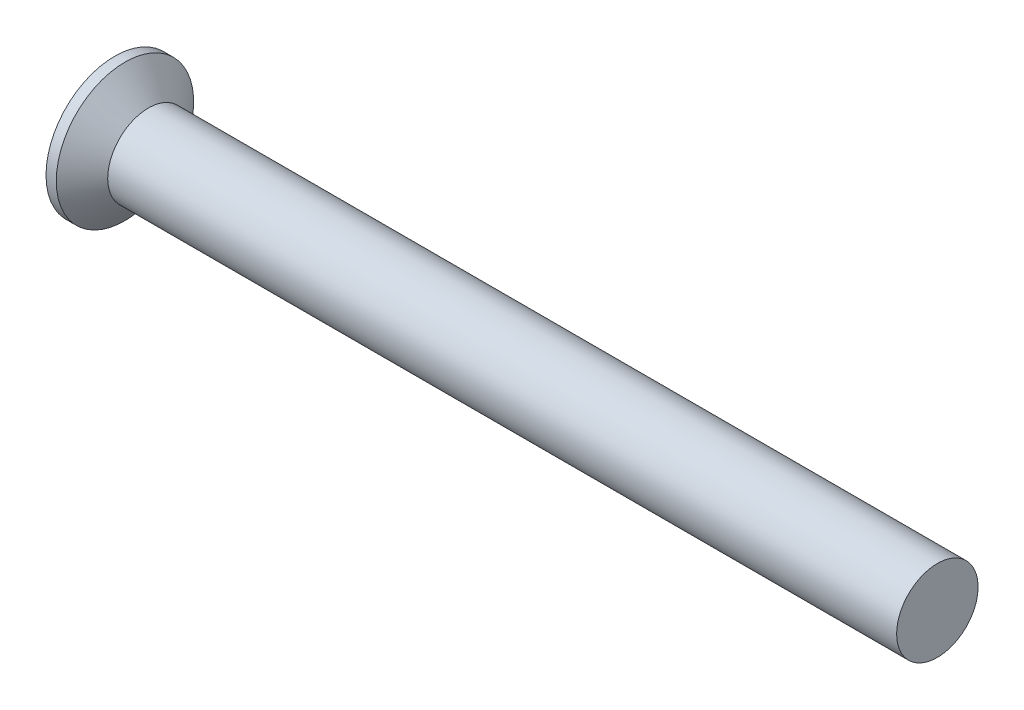
ISO-10303-21;
HEADER;
FILE_DESCRIPTION(('STEP AP214'),'2;1');
FILE_NAME('part.step','',(''),(''),'','','');
FILE_SCHEMA(('AUTOMOTIVE_DESIGN { 1 0 10303 214 1 1 1 1 }'));
ENDSEC;
DATA;
#1=APPLICATION_CONTEXT('core data for automotive mechanical design processes');
#2=APPLICATION_PROTOCOL_DEFINITION('international standard','automotive_design',2000,#1);
#3=PRODUCT_CONTEXT('',#1,'mechanical');
#4=PRODUCT('Part','Part','',(#3));
#5=PRODUCT_RELATED_PRODUCT_CATEGORY('part','',(#4));
#6=PRODUCT_DEFINITION_FORMATION('','',#4);
#7=PRODUCT_DEFINITION_CONTEXT('part definition',#1,'design');
#8=PRODUCT_DEFINITION('design','',#6,#7);
#9=PRODUCT_DEFINITION_SHAPE('','',#8);
#10=(LENGTH_UNIT() NAMED_UNIT(*) SI_UNIT(.MILLI.,.METRE.));
#11=(NAMED_UNIT(*) PLANE_ANGLE_UNIT() SI_UNIT($,.RADIAN.));
#12=(NAMED_UNIT(*) SI_UNIT($,.STERADIAN.) SOLID_ANGLE_UNIT());
#13=UNCERTAINTY_MEASURE_WITH_UNIT(LENGTH_MEASURE(1.E-05),#10,'distance_accuracy_value','');
#14=(GEOMETRIC_REPRESENTATION_CONTEXT(3) GLOBAL_UNCERTAINTY_ASSIGNED_CONTEXT((#13)) GLOBAL_UNIT_ASSIGNED_CONTEXT((#10,
#11,#12)) REPRESENTATION_CONTEXT('',''));
#15=CARTESIAN_POINT('',(0.,0.,0.));
#16=DIRECTION('',(0.,0.,1.));
#17=DIRECTION('',(1.,0.,0.));
#18=AXIS2_PLACEMENT_3D('',#15,#16,#17);
#19=CARTESIAN_POINT('',(0.,0.,0.));
#20=DIRECTION('',(-1.,0.,0.));
#21=DIRECTION('',(0.,0.,1.));
#22=AXIS2_PLACEMENT_3D('',#19,#20,#21);
#23=PLANE('',#22);
#24=CARTESIAN_POINT('',(0.,0.,0.));
#25=DIRECTION('',(-1.,0.,0.));
#26=DIRECTION('',(0.,0.,1.));
#27=AXIS2_PLACEMENT_3D('',#24,#25,#26);
#28=CIRCLE('',#27,2.1209);
#29=CARTESIAN_POINT('',(0.,0.,2.1209));
#30=VERTEX_POINT('',#29);
#31=EDGE_CURVE('E40',#30,#30,#28,.T.);
#32=ORIENTED_EDGE('',*,*,#31,.T.);
#33=EDGE_LOOP('',(#32));
#34=FACE_BOUND('',#33,.T.);
#35=DIRECTION('',(0.,1.,0.));
#36=VECTOR('',#35,1.);
#37=CARTESIAN_POINT('',(0.,-1.4986,-0.342899999999999));
#38=LINE('',#37,#36);
#39=CARTESIAN_POINT('',(0.,-1.4986,-0.342899999999999));
#40=VERTEX_POINT('',#39);
#41=CARTESIAN_POINT('',(0.,-0.342899999999999,-0.342899999999999));
#42=VERTEX_POINT('',#41);
#43=EDGE_CURVE('E101',#40,#42,#38,.T.);
#44=ORIENTED_EDGE('',*,*,#43,.T.);
#45=DIRECTION('',(0.,0.,-1.));
#46=VECTOR('',#45,1.);
#47=CARTESIAN_POINT('',(0.,-0.342900000000005,1.4986));
#48=LINE('',#47,#46);
#49=CARTESIAN_POINT('',(0.,-0.342899999999995,-1.4986));
#50=VERTEX_POINT('',#49);
#51=EDGE_CURVE('E81',#42,#50,#48,.T.);
#52=ORIENTED_EDGE('',*,*,#51,.T.);
#53=DIRECTION('',(0.,1.,0.));
#54=VECTOR('',#53,1.);
#55=CARTESIAN_POINT('',(0.,-0.342899999999995,-1.4986));
#56=LINE('',#55,#54);
#57=CARTESIAN_POINT('',(0.,0.342900000000004,-1.4986));
#58=VERTEX_POINT('',#57);
#59=EDGE_CURVE('E336',#50,#58,#56,.T.);
#60=ORIENTED_EDGE('',*,*,#59,.T.);
#61=DIRECTION('',(0.,0.,1.));
#62=VECTOR('',#61,1.);
#63=CARTESIAN_POINT('',(0.,0.342900000000004,-1.4986));
#64=LINE('',#63,#62);
#65=CARTESIAN_POINT('',(0.,0.3429,-0.342899999999999));
#66=VERTEX_POINT('',#65);
#67=EDGE_CURVE('E97',#58,#66,#64,.T.);
#68=ORIENTED_EDGE('',*,*,#67,.T.);
#69=CARTESIAN_POINT('',(0.,1.4986,-0.342899999999999));
#70=VERTEX_POINT('',#69);
#71=EDGE_CURVE('E91',#66,#70,#38,.T.);
#72=ORIENTED_EDGE('',*,*,#71,.T.);
#73=DIRECTION('',(0.,0.,1.));
#74=VECTOR('',#73,1.);
#75=CARTESIAN_POINT('',(0.,1.4986,-0.342899999999999));
#76=LINE('',#75,#74);
#77=CARTESIAN_POINT('',(0.,1.4986,0.3429));
#78=VERTEX_POINT('',#77);
#79=EDGE_CURVE('E94',#70,#78,#76,.T.);
#80=ORIENTED_EDGE('',*,*,#79,.T.);
#81=DIRECTION('',(0.,-1.,0.));
#82=VECTOR('',#81,1.);
#83=CARTESIAN_POINT('',(0.,1.4986,0.3429));
#84=LINE('',#83,#82);
#85=CARTESIAN_POINT('',(0.,0.342899999999998,0.3429));
#86=VERTEX_POINT('',#85);
#87=EDGE_CURVE('E348',#78,#86,#84,.T.);
#88=ORIENTED_EDGE('',*,*,#87,.T.);
#89=CARTESIAN_POINT('',(0.,0.342899999999994,1.4986));
#90=VERTEX_POINT('',#89);
#91=EDGE_CURVE('E331',#86,#90,#64,.T.);
#92=ORIENTED_EDGE('',*,*,#91,.T.);
#93=DIRECTION('',(0.,-1.,0.));
#94=VECTOR('',#93,1.);
#95=CARTESIAN_POINT('',(0.,0.342899999999994,1.4986));
#96=LINE('',#95,#94);
#97=CARTESIAN_POINT('',(0.,-0.342900000000005,1.4986));
#98=VERTEX_POINT('',#97);
#99=EDGE_CURVE('E317',#90,#98,#96,.T.);
#100=ORIENTED_EDGE('',*,*,#99,.T.);
#101=CARTESIAN_POINT('',(0.,-0.342900000000001,0.3429));
#102=VERTEX_POINT('',#101);
#103=EDGE_CURVE('E329',#98,#102,#48,.T.);
#104=ORIENTED_EDGE('',*,*,#103,.T.);
#105=CARTESIAN_POINT('',(0.,-1.4986,0.3429));
#106=VERTEX_POINT('',#105);
#107=EDGE_CURVE('E107',#102,#106,#84,.T.);
#108=ORIENTED_EDGE('',*,*,#107,.T.);
#109=DIRECTION('',(0.,0.,-1.));
#110=VECTOR('',#109,1.);
#111=CARTESIAN_POINT('',(0.,-1.4986,0.3429));
#112=LINE('',#111,#110);
#113=EDGE_CURVE('E130',#106,#40,#112,.T.);
#114=ORIENTED_EDGE('',*,*,#113,.T.);
#115=EDGE_LOOP('',(#44,#52,#60,#68,#72,#80,#88,#92,#100,#104,#108,#114));
#116=FACE_BOUND('',#115,.T.);
#117=ADVANCED_FACE('F33',(#34,#116),#23,.T.);
#118=CARTESIAN_POINT('',(2.20846315789474,0.,0.149300956937799));
#119=DIRECTION('',(-0.0873274378854346,0.,-0.996179661804218));
#120=DIRECTION('',(-0.996179661804218,0.,0.0873274378854346));
#121=AXIS2_PLACEMENT_3D('',#118,#119,#120);
#122=PLANE('',#121);
#123=ORIENTED_EDGE('',*,*,#107,.F.);
#124=DIRECTION('',(0.992402776654459,0.0869963473041249,-0.0869963473041246));
#125=VECTOR('',#124,1.);
#126=CARTESIAN_POINT('',(2.22135311821424,-0.148170992883818,0.148170992883817));
#127=LINE('',#126,#125);
#128=CARTESIAN_POINT('',(1.9558,-0.171450000000001,0.171449999999999));
#129=VERTEX_POINT('',#128);
#130=EDGE_CURVE('E125',#102,#129,#127,.T.);
#131=ORIENTED_EDGE('',*,*,#130,.T.);
#132=DIRECTION('',(0.82530731049455,0.56002996069273,-0.072348368127769));
#133=VECTOR('',#132,1.);
#134=CARTESIAN_POINT('',(0.,-1.4986,0.3429));
#135=LINE('',#134,#133);
#136=EDGE_CURVE('E102',#106,#129,#135,.T.);
#137=ORIENTED_EDGE('',*,*,#136,.F.);
#138=EDGE_LOOP('',(#123,#131,#137));
#139=FACE_BOUND('',#138,.T.);
#140=ADVANCED_FACE('F153',(#139),#122,.T.);
#141=DIRECTION('',(0.82530731049455,-0.56002996069273,-0.0723483681277689));
#142=VECTOR('',#141,1.);
#143=CARTESIAN_POINT('',(0.,1.4986,0.3429));
#144=LINE('',#143,#142);
#145=CARTESIAN_POINT('',(1.9558,0.17145,0.17145));
#146=VERTEX_POINT('',#145);
#147=EDGE_CURVE('E47',#78,#146,#144,.T.);
#148=ORIENTED_EDGE('',*,*,#147,.T.);
#149=DIRECTION('',(-0.992402776654459,0.0869963473041239,0.0869963473041246));
#150=VECTOR('',#149,1.);
#151=CARTESIAN_POINT('',(2.22135311821424,0.148170992883816,0.148170992883817));
#152=LINE('',#151,#150);
#153=EDGE_CURVE('E344',#146,#86,#152,.T.);
#154=ORIENTED_EDGE('',*,*,#153,.T.);
#155=ORIENTED_EDGE('',*,*,#87,.F.);
#156=EDGE_LOOP('',(#148,#154,#155));
#157=FACE_BOUND('',#156,.T.);
#158=ADVANCED_FACE('F157',(#157),#122,.T.);
#159=CARTESIAN_POINT('',(2.20846315789474,0.,-0.149300956937799));
#160=DIRECTION('',(-0.0873274378854342,0.,0.996179661804218));
#161=DIRECTION('',(0.996179661804218,0.,0.0873274378854342));
#162=AXIS2_PLACEMENT_3D('',#159,#160,#161);
#163=PLANE('',#162);
#164=DIRECTION('',(0.82530731049455,0.56002996069273,0.0723483681277687));
#165=VECTOR('',#164,1.);
#166=CARTESIAN_POINT('',(0.,-1.4986,-0.342899999999999));
#167=LINE('',#166,#165);
#168=CARTESIAN_POINT('',(1.9558,-0.17145,-0.171450000000001));
#169=VERTEX_POINT('',#168);
#170=EDGE_CURVE('E56',#40,#169,#167,.T.);
#171=ORIENTED_EDGE('',*,*,#170,.T.);
#172=DIRECTION('',(-0.992402776654459,-0.0869963473041243,-0.0869963473041242));
#173=VECTOR('',#172,1.);
#174=CARTESIAN_POINT('',(2.22135311821423,-0.148170992883817,-0.148170992883817));
#175=LINE('',#174,#173);
#176=EDGE_CURVE('E11',#169,#42,#175,.T.);
#177=ORIENTED_EDGE('',*,*,#176,.T.);
#178=ORIENTED_EDGE('',*,*,#43,.F.);
#179=EDGE_LOOP('',(#171,#177,#178));
#180=FACE_BOUND('',#179,.T.);
#181=ADVANCED_FACE('F150',(#180),#163,.T.);
#182=ORIENTED_EDGE('',*,*,#71,.F.);
#183=DIRECTION('',(0.992402776654459,-0.0869963473041245,0.0869963473041242));
#184=VECTOR('',#183,1.);
#185=CARTESIAN_POINT('',(2.22135311821423,0.148170992883818,-0.148170992883817));
#186=LINE('',#185,#184);
#187=CARTESIAN_POINT('',(1.9558,0.17145,-0.17145));
#188=VERTEX_POINT('',#187);
#189=EDGE_CURVE('E110',#66,#188,#186,.T.);
#190=ORIENTED_EDGE('',*,*,#189,.T.);
#191=DIRECTION('',(0.82530731049455,-0.560029960692731,0.0723483681277686));
#192=VECTOR('',#191,1.);
#193=CARTESIAN_POINT('',(0.,1.4986,-0.342899999999999));
#194=LINE('',#193,#192);
#195=EDGE_CURVE('E106',#70,#188,#194,.T.);
#196=ORIENTED_EDGE('',*,*,#195,.F.);
#197=EDGE_LOOP('',(#182,#190,#196));
#198=FACE_BOUND('',#197,.T.);
#199=ADVANCED_FACE('F109',(#198),#163,.T.);
#200=CARTESIAN_POINT('',(-6.34999999999999,0.,0.));
#201=DIRECTION('',(-1.,0.,0.));
#202=DIRECTION('',(0.,0.,1.));
#203=AXIS2_PLACEMENT_3D('',#200,#201,#202);
#204=CYLINDRICAL_SURFACE('',#203,2.1209);
#205=CARTESIAN_POINT('',(0.316753558515302,0.,0.));
#206=DIRECTION('',(-1.,0.,0.));
#207=DIRECTION('',(0.,0.,1.));
#208=AXIS2_PLACEMENT_3D('',#205,#206,#207);
#209=CIRCLE('',#208,2.1209);
#210=CARTESIAN_POINT('',(0.316753558515302,0.,2.1209));
#211=VERTEX_POINT('',#210);
#212=EDGE_CURVE('E133',#211,#211,#209,.T.);
#213=ORIENTED_EDGE('',*,*,#212,.T.);
#214=EDGE_LOOP('',(#213));
#215=FACE_BOUND('',#214,.T.);
#216=ORIENTED_EDGE('',*,*,#31,.F.);
#217=EDGE_LOOP('',(#216));
#218=FACE_BOUND('',#217,.T.);
#219=ADVANCED_FACE('F139',(#215,#218),#204,.T.);
#220=CARTESIAN_POINT('',(0.316753558515302,0.,0.));
#221=DIRECTION('',(-1.,0.,0.));
#222=DIRECTION('',(0.,0.,1.));
#223=AXIS2_PLACEMENT_3D('',#220,#221,#222);
#224=CONICAL_SURFACE('',#223,2.1209,0.872664625997166);
#225=CARTESIAN_POINT('',(1.0414,0.,0.));
#226=DIRECTION('',(-1.,0.,0.));
#227=DIRECTION('',(0.,0.,1.));
#228=AXIS2_PLACEMENT_3D('',#225,#226,#227);
#229=CIRCLE('',#228,1.2573);
#230=CARTESIAN_POINT('',(1.0414,0.,1.2573));
#231=VERTEX_POINT('',#230);
#232=EDGE_CURVE('E129',#231,#231,#229,.T.);
#233=ORIENTED_EDGE('',*,*,#232,.T.);
#234=EDGE_LOOP('',(#233));
#235=FACE_BOUND('',#234,.T.);
#236=ORIENTED_EDGE('',*,*,#212,.F.);
#237=EDGE_LOOP('',(#236));
#238=FACE_BOUND('',#237,.T.);
#239=ADVANCED_FACE('F141',(#235,#238),#224,.T.);
#240=CARTESIAN_POINT('',(-6.34999999999999,0.,0.));
#241=DIRECTION('',(-1.,0.,0.));
#242=DIRECTION('',(0.,0.,1.));
#243=AXIS2_PLACEMENT_3D('',#240,#241,#242);
#244=CYLINDRICAL_SURFACE('',#243,1.2573);
#245=CARTESIAN_POINT('',(25.4,0.,0.));
#246=DIRECTION('',(-1.,0.,0.));
#247=DIRECTION('',(0.,0.,1.));
#248=AXIS2_PLACEMENT_3D('',#245,#246,#247);
#249=CIRCLE('',#248,1.2573);
#250=CARTESIAN_POINT('',(25.4,0.,1.2573));
#251=VERTEX_POINT('',#250);
#252=EDGE_CURVE('E126',#251,#251,#249,.T.);
#253=ORIENTED_EDGE('',*,*,#252,.T.);
#254=EDGE_LOOP('',(#253));
#255=FACE_BOUND('',#254,.T.);
#256=ORIENTED_EDGE('',*,*,#232,.F.);
#257=EDGE_LOOP('',(#256));
#258=FACE_BOUND('',#257,.T.);
#259=ADVANCED_FACE('F147',(#255,#258),#244,.T.);
#260=CARTESIAN_POINT('',(25.4,1.2573,0.));
#261=DIRECTION('',(1.,0.,0.));
#262=DIRECTION('',(0.,0.,-1.));
#263=AXIS2_PLACEMENT_3D('',#260,#261,#262);
#264=PLANE('',#263);
#265=ORIENTED_EDGE('',*,*,#252,.F.);
#266=EDGE_LOOP('',(#265));
#267=FACE_BOUND('',#266,.T.);
#268=ADVANCED_FACE('F177',(#267),#264,.T.);
#269=CARTESIAN_POINT('',(1.9558,0.17145,-0.17145));
#270=DIRECTION('',(1.,0.,0.));
#271=DIRECTION('',(0.,0.,-1.));
#272=AXIS2_PLACEMENT_3D('',#269,#270,#271);
#273=PLANE('',#272);
#274=DIRECTION('',(0.,1.,0.));
#275=VECTOR('',#274,1.);
#276=CARTESIAN_POINT('',(1.9558,-0.17145,-0.17145));
#277=LINE('',#276,#275);
#278=EDGE_CURVE('E121',#169,#188,#277,.T.);
#279=ORIENTED_EDGE('',*,*,#278,.F.);
#280=DIRECTION('',(0.,0.,-1.));
#281=VECTOR('',#280,1.);
#282=CARTESIAN_POINT('',(1.9558,-0.17145,0.17145));
#283=LINE('',#282,#281);
#284=EDGE_CURVE('E112',#129,#169,#283,.T.);
#285=ORIENTED_EDGE('',*,*,#284,.F.);
#286=DIRECTION('',(0.,-1.,0.));
#287=VECTOR('',#286,1.);
#288=CARTESIAN_POINT('',(1.9558,0.17145,0.17145));
#289=LINE('',#288,#287);
#290=EDGE_CURVE('E115',#146,#129,#289,.T.);
#291=ORIENTED_EDGE('',*,*,#290,.F.);
#292=DIRECTION('',(0.,0.,1.));
#293=VECTOR('',#292,1.);
#294=CARTESIAN_POINT('',(1.9558,0.17145,-0.17145));
#295=LINE('',#294,#293);
#296=EDGE_CURVE('E119',#188,#146,#295,.T.);
#297=ORIENTED_EDGE('',*,*,#296,.F.);
#298=EDGE_LOOP('',(#279,#285,#291,#297));
#299=FACE_BOUND('',#298,.T.);
#300=ADVANCED_FACE('F174',(#299),#273,.F.);
#301=CARTESIAN_POINT('',(1.9558,-0.17145,-0.17145));
#302=DIRECTION('',(-0.561501418337264,0.827475774391759,0.));
#303=DIRECTION('',(-0.827475774391759,-0.561501418337264,0.));
#304=AXIS2_PLACEMENT_3D('',#301,#302,#303);
#305=PLANE('',#304);
#306=ORIENTED_EDGE('',*,*,#170,.F.);
#307=ORIENTED_EDGE('',*,*,#113,.F.);
#308=ORIENTED_EDGE('',*,*,#136,.T.);
#309=ORIENTED_EDGE('',*,*,#284,.T.);
#310=EDGE_LOOP('',(#306,#307,#308,#309));
#311=FACE_BOUND('',#310,.T.);
#312=ADVANCED_FACE('F166',(#311),#305,.T.);
#313=CARTESIAN_POINT('',(0.,1.4986,0.3429));
#314=DIRECTION('',(-0.561501418337265,-0.827475774391758,0.));
#315=DIRECTION('',(0.827475774391758,-0.561501418337265,0.));
#316=AXIS2_PLACEMENT_3D('',#313,#314,#315);
#317=PLANE('',#316);
#318=ORIENTED_EDGE('',*,*,#147,.F.);
#319=ORIENTED_EDGE('',*,*,#79,.F.);
#320=ORIENTED_EDGE('',*,*,#195,.T.);
#321=ORIENTED_EDGE('',*,*,#296,.T.);
#322=EDGE_LOOP('',(#318,#319,#320,#321));
#323=FACE_BOUND('',#322,.T.);
#324=ADVANCED_FACE('F105',(#323),#317,.T.);
#325=CARTESIAN_POINT('',(2.20846315789474,-0.149300956937799,0.));
#326=DIRECTION('',(-0.0873274378854346,0.996179661804218,0.));
#327=DIRECTION('',(-0.996179661804218,-0.0873274378854346,0.));
#328=AXIS2_PLACEMENT_3D('',#325,#326,#327);
#329=PLANE('',#328);
#330=DIRECTION('',(0.82530731049455,0.072348368127767,0.56002996069273));
#331=VECTOR('',#330,1.);
#332=CARTESIAN_POINT('',(0.,-0.342899999999995,-1.4986));
#333=LINE('',#332,#331);
#334=EDGE_CURVE('E338',#50,#169,#333,.T.);
#335=ORIENTED_EDGE('',*,*,#334,.F.);
#336=ORIENTED_EDGE('',*,*,#51,.F.);
#337=ORIENTED_EDGE('',*,*,#176,.F.);
#338=EDGE_LOOP('',(#335,#336,#337));
#339=FACE_BOUND('',#338,.T.);
#340=ADVANCED_FACE('F173',(#339),#329,.T.);
#341=CARTESIAN_POINT('',(2.20846315789474,0.149300956937799,0.));
#342=DIRECTION('',(-0.0873274378854342,-0.996179661804218,0.));
#343=DIRECTION('',(0.996179661804218,-0.0873274378854342,0.));
#344=AXIS2_PLACEMENT_3D('',#341,#342,#343);
#345=PLANE('',#344);
#346=ORIENTED_EDGE('',*,*,#67,.F.);
#347=DIRECTION('',(0.82530731049455,-0.0723483681277706,0.56002996069273));
#348=VECTOR('',#347,1.);
#349=CARTESIAN_POINT('',(0.,0.342900000000004,-1.4986));
#350=LINE('',#349,#348);
#351=EDGE_CURVE('E72',#58,#188,#350,.T.);
#352=ORIENTED_EDGE('',*,*,#351,.T.);
#353=ORIENTED_EDGE('',*,*,#189,.F.);
#354=EDGE_LOOP('',(#346,#352,#353));
#355=FACE_BOUND('',#354,.T.);
#356=ADVANCED_FACE('F217',(#355),#345,.T.);
#357=CARTESIAN_POINT('',(1.9558,0.171450000000001,-0.17145));
#358=DIRECTION('',(-0.561501418337264,0.,0.827475774391759));
#359=DIRECTION('',(-0.827475774391759,0.,-0.561501418337264));
#360=AXIS2_PLACEMENT_3D('',#357,#358,#359);
#361=PLANE('',#360);
#362=ORIENTED_EDGE('',*,*,#351,.F.);
#363=ORIENTED_EDGE('',*,*,#59,.F.);
#364=ORIENTED_EDGE('',*,*,#334,.T.);
#365=ORIENTED_EDGE('',*,*,#278,.T.);
#366=EDGE_LOOP('',(#362,#363,#364,#365));
#367=FACE_BOUND('',#366,.T.);
#368=ADVANCED_FACE('F225',(#367),#361,.T.);
#369=ORIENTED_EDGE('',*,*,#103,.F.);
#370=DIRECTION('',(0.82530731049455,0.0723483681277708,-0.56002996069273));
#371=VECTOR('',#370,1.);
#372=CARTESIAN_POINT('',(0.,-0.342900000000005,1.4986));
#373=LINE('',#372,#371);
#374=EDGE_CURVE('E314',#98,#129,#373,.T.);
#375=ORIENTED_EDGE('',*,*,#374,.T.);
#376=ORIENTED_EDGE('',*,*,#130,.F.);
#377=EDGE_LOOP('',(#369,#375,#376));
#378=FACE_BOUND('',#377,.T.);
#379=ADVANCED_FACE('F219',(#378),#329,.T.);
#380=DIRECTION('',(0.82530731049455,-0.0723483681277667,-0.560029960692731));
#381=VECTOR('',#380,1.);
#382=CARTESIAN_POINT('',(0.,0.342899999999994,1.4986));
#383=LINE('',#382,#381);
#384=EDGE_CURVE('E325',#90,#146,#383,.T.);
#385=ORIENTED_EDGE('',*,*,#384,.F.);
#386=ORIENTED_EDGE('',*,*,#91,.F.);
#387=ORIENTED_EDGE('',*,*,#153,.F.);
#388=EDGE_LOOP('',(#385,#386,#387));
#389=FACE_BOUND('',#388,.T.);
#390=ADVANCED_FACE('F227',(#389),#345,.T.);
#391=CARTESIAN_POINT('',(0.,-0.342900000000005,1.4986));
#392=DIRECTION('',(-0.561501418337265,0.,-0.827475774391758));
#393=DIRECTION('',(0.827475774391758,0.,-0.561501418337265));
#394=AXIS2_PLACEMENT_3D('',#391,#392,#393);
#395=PLANE('',#394);
#396=ORIENTED_EDGE('',*,*,#374,.F.);
#397=ORIENTED_EDGE('',*,*,#99,.F.);
#398=ORIENTED_EDGE('',*,*,#384,.T.);
#399=ORIENTED_EDGE('',*,*,#290,.T.);
#400=EDGE_LOOP('',(#396,#397,#398,#399));
#401=FACE_BOUND('',#400,.T.);
#402=ADVANCED_FACE('F246',(#401),#395,.T.);
#403=CLOSED_SHELL('',(#117,#140,#158,#181,#199,#219,#239,#259,#268,#300,#312,#324,#340,#356,
#368,#379,#390,#402));
#404=MANIFOLD_SOLID_BREP('B2',#403);
#405=ADVANCED_BREP_SHAPE_REPRESENTATION('',(#18,#404),#14);
#406=SHAPE_DEFINITION_REPRESENTATION(#9,#405);
ENDSEC;
END-ISO-10303-21;
